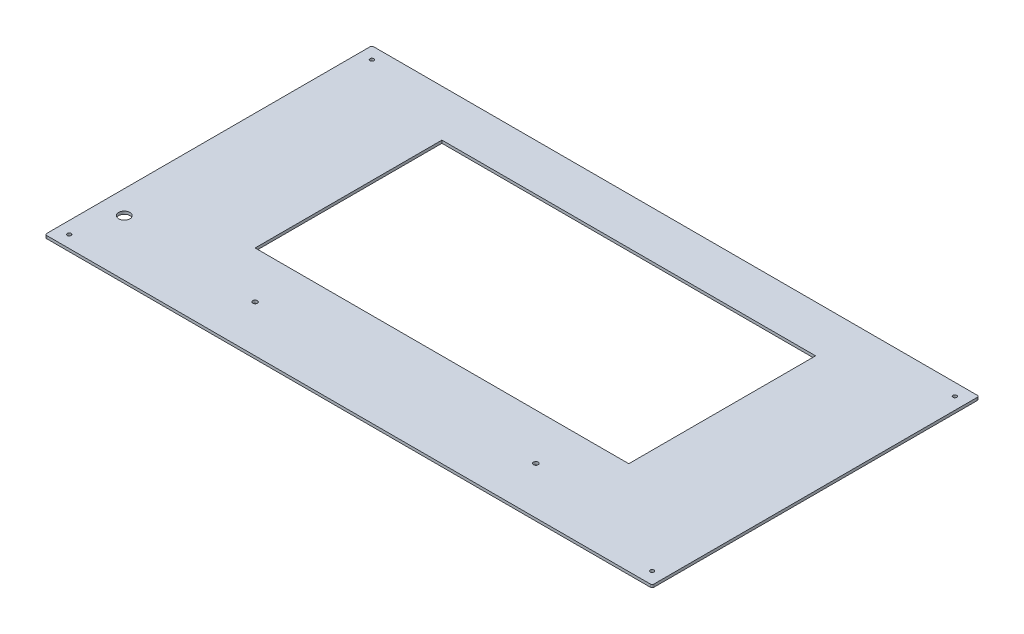
ISO-10303-21;
HEADER;
FILE_DESCRIPTION(('STEP AP214'),'2;1');
FILE_NAME('part.step','',(''),(''),'','','');
FILE_SCHEMA(('AUTOMOTIVE_DESIGN { 1 0 10303 214 1 1 1 1 }'));
ENDSEC;
DATA;
#1=APPLICATION_CONTEXT('core data for automotive mechanical design processes');
#2=APPLICATION_PROTOCOL_DEFINITION('international standard','automotive_design',2000,#1);
#3=PRODUCT_CONTEXT('',#1,'mechanical');
#4=PRODUCT('Part','Part','',(#3));
#5=PRODUCT_RELATED_PRODUCT_CATEGORY('part','',(#4));
#6=PRODUCT_DEFINITION_FORMATION('','',#4);
#7=PRODUCT_DEFINITION_CONTEXT('part definition',#1,'design');
#8=PRODUCT_DEFINITION('design','',#6,#7);
#9=PRODUCT_DEFINITION_SHAPE('','',#8);
#10=(LENGTH_UNIT() NAMED_UNIT(*) SI_UNIT(.MILLI.,.METRE.));
#11=(NAMED_UNIT(*) PLANE_ANGLE_UNIT() SI_UNIT($,.RADIAN.));
#12=(NAMED_UNIT(*) SI_UNIT($,.STERADIAN.) SOLID_ANGLE_UNIT());
#13=UNCERTAINTY_MEASURE_WITH_UNIT(LENGTH_MEASURE(1.E-05),#10,'distance_accuracy_value','');
#14=(GEOMETRIC_REPRESENTATION_CONTEXT(3) GLOBAL_UNCERTAINTY_ASSIGNED_CONTEXT((#13)) GLOBAL_UNIT_ASSIGNED_CONTEXT((#10,
#11,#12)) REPRESENTATION_CONTEXT('',''));
#15=CARTESIAN_POINT('',(0.,0.,0.));
#16=DIRECTION('',(0.,0.,1.));
#17=DIRECTION('',(1.,0.,0.));
#18=AXIS2_PLACEMENT_3D('',#15,#16,#17);
#19=CARTESIAN_POINT('',(648.,-3.,-348.));
#20=DIRECTION('',(0.,1.,0.));
#21=DIRECTION('',(0.,0.,1.));
#22=AXIS2_PLACEMENT_3D('',#19,#20,#21);
#23=CYLINDRICAL_SURFACE('',#22,2.);
#24=CARTESIAN_POINT('',(648.,0.,-348.));
#25=DIRECTION('',(0.,1.,0.));
#26=DIRECTION('',(0.,0.,-1.));
#27=AXIS2_PLACEMENT_3D('',#24,#25,#26);
#28=CIRCLE('',#27,2.);
#29=CARTESIAN_POINT('',(650.,0.,-348.));
#30=VERTEX_POINT('',#29);
#31=CARTESIAN_POINT('',(648.,0.,-350.));
#32=VERTEX_POINT('',#31);
#33=EDGE_CURVE('E186',#30,#32,#28,.T.);
#34=ORIENTED_EDGE('',*,*,#33,.F.);
#35=DIRECTION('',(0.,1.,0.));
#36=VECTOR('',#35,1.);
#37=CARTESIAN_POINT('',(650.,-3.,-348.));
#38=LINE('',#37,#36);
#39=CARTESIAN_POINT('',(650.,-3.,-348.));
#40=VERTEX_POINT('',#39);
#41=EDGE_CURVE('E11',#40,#30,#38,.T.);
#42=ORIENTED_EDGE('',*,*,#41,.F.);
#43=CARTESIAN_POINT('',(648.,-3.,-348.));
#44=DIRECTION('',(0.,1.,0.));
#45=DIRECTION('',(0.,0.,-1.));
#46=AXIS2_PLACEMENT_3D('',#43,#44,#45);
#47=CIRCLE('',#46,2.);
#48=CARTESIAN_POINT('',(648.,-3.,-350.));
#49=VERTEX_POINT('',#48);
#50=EDGE_CURVE('E189',#40,#49,#47,.T.);
#51=ORIENTED_EDGE('',*,*,#50,.T.);
#52=DIRECTION('',(0.,1.,0.));
#53=VECTOR('',#52,1.);
#54=CARTESIAN_POINT('',(648.,-3.,-350.));
#55=LINE('',#54,#53);
#56=EDGE_CURVE('E38',#49,#32,#55,.T.);
#57=ORIENTED_EDGE('',*,*,#56,.T.);
#58=EDGE_LOOP('',(#34,#42,#51,#57));
#59=FACE_BOUND('',#58,.T.);
#60=ADVANCED_FACE('F35',(#59),#23,.T.);
#61=CARTESIAN_POINT('',(650.,-3.,-2.));
#62=DIRECTION('',(1.,0.,0.));
#63=DIRECTION('',(0.,0.,-1.));
#64=AXIS2_PLACEMENT_3D('',#61,#62,#63);
#65=PLANE('',#64);
#66=DIRECTION('',(0.,0.,-1.));
#67=VECTOR('',#66,1.);
#68=CARTESIAN_POINT('',(650.,0.,-2.));
#69=LINE('',#68,#67);
#70=CARTESIAN_POINT('',(650.,0.,-2.));
#71=VERTEX_POINT('',#70);
#72=EDGE_CURVE('E193',#71,#30,#69,.T.);
#73=ORIENTED_EDGE('',*,*,#72,.F.);
#74=DIRECTION('',(0.,1.,0.));
#75=VECTOR('',#74,1.);
#76=CARTESIAN_POINT('',(650.,-3.,-2.));
#77=LINE('',#76,#75);
#78=CARTESIAN_POINT('',(650.,-3.,-2.));
#79=VERTEX_POINT('',#78);
#80=EDGE_CURVE('E43',#79,#71,#77,.T.);
#81=ORIENTED_EDGE('',*,*,#80,.F.);
#82=DIRECTION('',(0.,0.,-1.));
#83=VECTOR('',#82,1.);
#84=CARTESIAN_POINT('',(650.,-3.,-2.));
#85=LINE('',#84,#83);
#86=EDGE_CURVE('E211',#79,#40,#85,.T.);
#87=ORIENTED_EDGE('',*,*,#86,.T.);
#88=ORIENTED_EDGE('',*,*,#41,.T.);
#89=EDGE_LOOP('',(#73,#81,#87,#88));
#90=FACE_BOUND('',#89,.T.);
#91=ADVANCED_FACE('F258',(#90),#65,.T.);
#92=CARTESIAN_POINT('',(648.,-3.,-2.));
#93=DIRECTION('',(0.,1.,0.));
#94=DIRECTION('',(0.,0.,1.));
#95=AXIS2_PLACEMENT_3D('',#92,#93,#94);
#96=CYLINDRICAL_SURFACE('',#95,2.);
#97=CARTESIAN_POINT('',(648.,0.,-2.));
#98=DIRECTION('',(0.,1.,0.));
#99=DIRECTION('',(0.,0.,1.));
#100=AXIS2_PLACEMENT_3D('',#97,#98,#99);
#101=CIRCLE('',#100,2.);
#102=CARTESIAN_POINT('',(648.,0.,0.));
#103=VERTEX_POINT('',#102);
#104=EDGE_CURVE('E231',#103,#71,#101,.T.);
#105=ORIENTED_EDGE('',*,*,#104,.F.);
#106=DIRECTION('',(0.,1.,0.));
#107=VECTOR('',#106,1.);
#108=CARTESIAN_POINT('',(648.,-3.,0.));
#109=LINE('',#108,#107);
#110=CARTESIAN_POINT('',(648.,-3.,0.));
#111=VERTEX_POINT('',#110);
#112=EDGE_CURVE('E237',#111,#103,#109,.T.);
#113=ORIENTED_EDGE('',*,*,#112,.F.);
#114=CARTESIAN_POINT('',(648.,-3.,-2.));
#115=DIRECTION('',(0.,1.,0.));
#116=DIRECTION('',(0.,0.,1.));
#117=AXIS2_PLACEMENT_3D('',#114,#115,#116);
#118=CIRCLE('',#117,2.);
#119=EDGE_CURVE('E208',#111,#79,#118,.T.);
#120=ORIENTED_EDGE('',*,*,#119,.T.);
#121=ORIENTED_EDGE('',*,*,#80,.T.);
#122=EDGE_LOOP('',(#105,#113,#120,#121));
#123=FACE_BOUND('',#122,.T.);
#124=ADVANCED_FACE('F278',(#123),#96,.T.);
#125=CARTESIAN_POINT('',(2.00000000000001,-3.,0.));
#126=DIRECTION('',(0.,0.,1.));
#127=DIRECTION('',(1.,0.,0.));
#128=AXIS2_PLACEMENT_3D('',#125,#126,#127);
#129=PLANE('',#128);
#130=DIRECTION('',(1.,0.,0.));
#131=VECTOR('',#130,1.);
#132=CARTESIAN_POINT('',(2.00000000000001,0.,0.));
#133=LINE('',#132,#131);
#134=CARTESIAN_POINT('',(2.00000000000001,0.,0.));
#135=VERTEX_POINT('',#134);
#136=EDGE_CURVE('E228',#135,#103,#133,.T.);
#137=ORIENTED_EDGE('',*,*,#136,.F.);
#138=DIRECTION('',(0.,1.,0.));
#139=VECTOR('',#138,1.);
#140=CARTESIAN_POINT('',(2.00000000000001,-3.,0.));
#141=LINE('',#140,#139);
#142=CARTESIAN_POINT('',(2.00000000000001,-3.,0.));
#143=VERTEX_POINT('',#142);
#144=EDGE_CURVE('E239',#143,#135,#141,.T.);
#145=ORIENTED_EDGE('',*,*,#144,.F.);
#146=DIRECTION('',(1.,0.,0.));
#147=VECTOR('',#146,1.);
#148=CARTESIAN_POINT('',(2.00000000000001,-3.,0.));
#149=LINE('',#148,#147);
#150=EDGE_CURVE('E205',#143,#111,#149,.T.);
#151=ORIENTED_EDGE('',*,*,#150,.T.);
#152=ORIENTED_EDGE('',*,*,#112,.T.);
#153=EDGE_LOOP('',(#137,#145,#151,#152));
#154=FACE_BOUND('',#153,.T.);
#155=ADVANCED_FACE('F276',(#154),#129,.T.);
#156=CARTESIAN_POINT('',(2.,-3.,-2.));
#157=DIRECTION('',(0.,1.,0.));
#158=DIRECTION('',(0.,0.,1.));
#159=AXIS2_PLACEMENT_3D('',#156,#157,#158);
#160=CYLINDRICAL_SURFACE('',#159,2.);
#161=CARTESIAN_POINT('',(2.,0.,-2.));
#162=DIRECTION('',(0.,1.,0.));
#163=DIRECTION('',(0.,0.,-1.));
#164=AXIS2_PLACEMENT_3D('',#161,#162,#163);
#165=CIRCLE('',#164,2.);
#166=CARTESIAN_POINT('',(0.,0.,-2.00000000000001));
#167=VERTEX_POINT('',#166);
#168=EDGE_CURVE('E225',#167,#135,#165,.T.);
#169=ORIENTED_EDGE('',*,*,#168,.F.);
#170=DIRECTION('',(0.,1.,0.));
#171=VECTOR('',#170,1.);
#172=CARTESIAN_POINT('',(0.,-3.,-2.00000000000001));
#173=LINE('',#172,#171);
#174=CARTESIAN_POINT('',(0.,-3.,-2.00000000000001));
#175=VERTEX_POINT('',#174);
#176=EDGE_CURVE('E241',#175,#167,#173,.T.);
#177=ORIENTED_EDGE('',*,*,#176,.F.);
#178=CARTESIAN_POINT('',(2.,-3.,-2.));
#179=DIRECTION('',(0.,1.,0.));
#180=DIRECTION('',(0.,0.,-1.));
#181=AXIS2_PLACEMENT_3D('',#178,#179,#180);
#182=CIRCLE('',#181,2.);
#183=EDGE_CURVE('E202',#175,#143,#182,.T.);
#184=ORIENTED_EDGE('',*,*,#183,.T.);
#185=ORIENTED_EDGE('',*,*,#144,.T.);
#186=EDGE_LOOP('',(#169,#177,#184,#185));
#187=FACE_BOUND('',#186,.T.);
#188=ADVANCED_FACE('F272',(#187),#160,.T.);
#189=CARTESIAN_POINT('',(0.,-3.,-2.00000000000001));
#190=DIRECTION('',(-1.,0.,0.));
#191=DIRECTION('',(0.,0.,1.));
#192=AXIS2_PLACEMENT_3D('',#189,#190,#191);
#193=PLANE('',#192);
#194=DIRECTION('',(0.,0.,1.));
#195=VECTOR('',#194,1.);
#196=CARTESIAN_POINT('',(0.,0.,-2.00000000000001));
#197=LINE('',#196,#195);
#198=CARTESIAN_POINT('',(0.,0.,-348.));
#199=VERTEX_POINT('',#198);
#200=EDGE_CURVE('E222',#199,#167,#197,.T.);
#201=ORIENTED_EDGE('',*,*,#200,.F.);
#202=DIRECTION('',(0.,1.,0.));
#203=VECTOR('',#202,1.);
#204=CARTESIAN_POINT('',(0.,-3.,-348.));
#205=LINE('',#204,#203);
#206=CARTESIAN_POINT('',(0.,-3.,-348.));
#207=VERTEX_POINT('',#206);
#208=EDGE_CURVE('E243',#207,#199,#205,.T.);
#209=ORIENTED_EDGE('',*,*,#208,.F.);
#210=DIRECTION('',(0.,0.,1.));
#211=VECTOR('',#210,1.);
#212=CARTESIAN_POINT('',(0.,-3.,-2.00000000000001));
#213=LINE('',#212,#211);
#214=EDGE_CURVE('E199',#207,#175,#213,.T.);
#215=ORIENTED_EDGE('',*,*,#214,.T.);
#216=ORIENTED_EDGE('',*,*,#176,.T.);
#217=EDGE_LOOP('',(#201,#209,#215,#216));
#218=FACE_BOUND('',#217,.T.);
#219=ADVANCED_FACE('F270',(#218),#193,.T.);
#220=CARTESIAN_POINT('',(2.,-3.,-348.));
#221=DIRECTION('',(0.,1.,0.));
#222=DIRECTION('',(0.,0.,1.));
#223=AXIS2_PLACEMENT_3D('',#220,#221,#222);
#224=CYLINDRICAL_SURFACE('',#223,2.);
#225=CARTESIAN_POINT('',(2.,0.,-348.));
#226=DIRECTION('',(0.,1.,0.));
#227=DIRECTION('',(0.,0.,1.));
#228=AXIS2_PLACEMENT_3D('',#225,#226,#227);
#229=CIRCLE('',#228,2.);
#230=CARTESIAN_POINT('',(2.,0.,-350.));
#231=VERTEX_POINT('',#230);
#232=EDGE_CURVE('E219',#231,#199,#229,.T.);
#233=ORIENTED_EDGE('',*,*,#232,.F.);
#234=DIRECTION('',(0.,1.,0.));
#235=VECTOR('',#234,1.);
#236=CARTESIAN_POINT('',(2.,-3.,-350.));
#237=LINE('',#236,#235);
#238=CARTESIAN_POINT('',(2.,-3.,-350.));
#239=VERTEX_POINT('',#238);
#240=EDGE_CURVE('E244',#239,#231,#237,.T.);
#241=ORIENTED_EDGE('',*,*,#240,.F.);
#242=CARTESIAN_POINT('',(2.,-3.,-348.));
#243=DIRECTION('',(0.,1.,0.));
#244=DIRECTION('',(0.,0.,1.));
#245=AXIS2_PLACEMENT_3D('',#242,#243,#244);
#246=CIRCLE('',#245,2.);
#247=EDGE_CURVE('E196',#239,#207,#246,.T.);
#248=ORIENTED_EDGE('',*,*,#247,.T.);
#249=ORIENTED_EDGE('',*,*,#208,.T.);
#250=EDGE_LOOP('',(#233,#241,#248,#249));
#251=FACE_BOUND('',#250,.T.);
#252=ADVANCED_FACE('F266',(#251),#224,.T.);
#253=CARTESIAN_POINT('',(2.,-3.,-350.));
#254=DIRECTION('',(0.,0.,-1.));
#255=DIRECTION('',(-1.,0.,0.));
#256=AXIS2_PLACEMENT_3D('',#253,#254,#255);
#257=PLANE('',#256);
#258=DIRECTION('',(-1.,0.,0.));
#259=VECTOR('',#258,1.);
#260=CARTESIAN_POINT('',(2.,0.,-350.));
#261=LINE('',#260,#259);
#262=EDGE_CURVE('E216',#32,#231,#261,.T.);
#263=ORIENTED_EDGE('',*,*,#262,.F.);
#264=ORIENTED_EDGE('',*,*,#56,.F.);
#265=DIRECTION('',(-1.,0.,0.));
#266=VECTOR('',#265,1.);
#267=CARTESIAN_POINT('',(2.,-3.,-350.));
#268=LINE('',#267,#266);
#269=EDGE_CURVE('E192',#49,#239,#268,.T.);
#270=ORIENTED_EDGE('',*,*,#269,.T.);
#271=ORIENTED_EDGE('',*,*,#240,.T.);
#272=EDGE_LOOP('',(#263,#264,#270,#271));
#273=FACE_BOUND('',#272,.T.);
#274=ADVANCED_FACE('F252',(#273),#257,.T.);
#275=CARTESIAN_POINT('',(648.,-3.,-348.));
#276=DIRECTION('',(0.,-1.,0.));
#277=DIRECTION('',(0.,0.,-1.));
#278=AXIS2_PLACEMENT_3D('',#275,#276,#277);
#279=PLANE('',#278);
#280=CARTESIAN_POINT('',(25.,-3.,-60.));
#281=DIRECTION('',(0.,1.,0.));
#282=DIRECTION('',(0.,0.,1.));
#283=AXIS2_PLACEMENT_3D('',#280,#281,#282);
#284=CIRCLE('',#283,6.00000000000001);
#285=CARTESIAN_POINT('',(25.,-3.,-54.));
#286=VERTEX_POINT('',#285);
#287=EDGE_CURVE('E465',#286,#286,#284,.T.);
#288=ORIENTED_EDGE('',*,*,#287,.T.);
#289=EDGE_LOOP('',(#288));
#290=FACE_BOUND('',#289,.T.);
#291=CARTESIAN_POINT('',(175.,-3.,-50.));
#292=DIRECTION('',(0.,1.,0.));
#293=DIRECTION('',(0.,0.,1.));
#294=AXIS2_PLACEMENT_3D('',#291,#292,#293);
#295=CIRCLE('',#294,2.50000000000002);
#296=CARTESIAN_POINT('',(175.,-3.,-47.5));
#297=VERTEX_POINT('',#296);
#298=EDGE_CURVE('E473',#297,#297,#295,.T.);
#299=ORIENTED_EDGE('',*,*,#298,.T.);
#300=EDGE_LOOP('',(#299));
#301=FACE_BOUND('',#300,.T.);
#302=CARTESIAN_POINT('',(475.,-3.,-50.4925614395433));
#303=DIRECTION('',(0.,1.,0.));
#304=DIRECTION('',(0.,0.,1.));
#305=AXIS2_PLACEMENT_3D('',#302,#303,#304);
#306=CIRCLE('',#305,2.50000000000002);
#307=CARTESIAN_POINT('',(475.,-3.,-47.9925614395433));
#308=VERTEX_POINT('',#307);
#309=EDGE_CURVE('E155',#308,#308,#306,.T.);
#310=ORIENTED_EDGE('',*,*,#309,.T.);
#311=EDGE_LOOP('',(#310));
#312=FACE_BOUND('',#311,.T.);
#313=DIRECTION('',(0.,0.,-1.));
#314=VECTOR('',#313,1.);
#315=CARTESIAN_POINT('',(525.,-3.,-100.));
#316=LINE('',#315,#314);
#317=CARTESIAN_POINT('',(525.,-3.,-100.));
#318=VERTEX_POINT('',#317);
#319=CARTESIAN_POINT('',(525.,-3.,-300.));
#320=VERTEX_POINT('',#319);
#321=EDGE_CURVE('E126',#318,#320,#316,.T.);
#322=ORIENTED_EDGE('',*,*,#321,.T.);
#323=DIRECTION('',(-1.,0.,0.));
#324=VECTOR('',#323,1.);
#325=CARTESIAN_POINT('',(525.,-3.,-300.));
#326=LINE('',#325,#324);
#327=CARTESIAN_POINT('',(125.,-3.,-300.));
#328=VERTEX_POINT('',#327);
#329=EDGE_CURVE('E135',#320,#328,#326,.T.);
#330=ORIENTED_EDGE('',*,*,#329,.T.);
#331=DIRECTION('',(0.,0.,1.));
#332=VECTOR('',#331,1.);
#333=CARTESIAN_POINT('',(125.,-3.,-99.9999999999999));
#334=LINE('',#333,#332);
#335=CARTESIAN_POINT('',(125.,-3.,-99.9999999999999));
#336=VERTEX_POINT('',#335);
#337=EDGE_CURVE('E51',#328,#336,#334,.T.);
#338=ORIENTED_EDGE('',*,*,#337,.T.);
#339=DIRECTION('',(1.,0.,0.));
#340=VECTOR('',#339,1.);
#341=CARTESIAN_POINT('',(525.,-3.,-100.));
#342=LINE('',#341,#340);
#343=EDGE_CURVE('E132',#336,#318,#342,.T.);
#344=ORIENTED_EDGE('',*,*,#343,.T.);
#345=EDGE_LOOP('',(#322,#330,#338,#344));
#346=FACE_BOUND('',#345,.T.);
#347=CARTESIAN_POINT('',(637.,-3.,-337.));
#348=DIRECTION('',(0.,1.,0.));
#349=DIRECTION('',(0.,0.,1.));
#350=AXIS2_PLACEMENT_3D('',#347,#348,#349);
#351=CIRCLE('',#350,2.);
#352=CARTESIAN_POINT('',(637.,-3.,-335.));
#353=VERTEX_POINT('',#352);
#354=EDGE_CURVE('E165',#353,#353,#351,.T.);
#355=ORIENTED_EDGE('',*,*,#354,.T.);
#356=EDGE_LOOP('',(#355));
#357=FACE_BOUND('',#356,.T.);
#358=CARTESIAN_POINT('',(13.,-3.,-337.));
#359=DIRECTION('',(0.,1.,0.));
#360=DIRECTION('',(0.,0.,1.));
#361=AXIS2_PLACEMENT_3D('',#358,#359,#360);
#362=CIRCLE('',#361,2.);
#363=CARTESIAN_POINT('',(13.,-3.,-335.));
#364=VERTEX_POINT('',#363);
#365=EDGE_CURVE('E171',#364,#364,#362,.T.);
#366=ORIENTED_EDGE('',*,*,#365,.T.);
#367=EDGE_LOOP('',(#366));
#368=FACE_BOUND('',#367,.T.);
#369=CARTESIAN_POINT('',(637.,-3.,-13.));
#370=DIRECTION('',(0.,1.,0.));
#371=DIRECTION('',(0.,0.,1.));
#372=AXIS2_PLACEMENT_3D('',#369,#370,#371);
#373=CIRCLE('',#372,2.);
#374=CARTESIAN_POINT('',(637.,-3.,-11.));
#375=VERTEX_POINT('',#374);
#376=EDGE_CURVE('E177',#375,#375,#373,.T.);
#377=ORIENTED_EDGE('',*,*,#376,.T.);
#378=EDGE_LOOP('',(#377));
#379=FACE_BOUND('',#378,.T.);
#380=CARTESIAN_POINT('',(13.,-3.,-13.));
#381=DIRECTION('',(0.,1.,0.));
#382=DIRECTION('',(0.,0.,1.));
#383=AXIS2_PLACEMENT_3D('',#380,#381,#382);
#384=CIRCLE('',#383,2.);
#385=CARTESIAN_POINT('',(13.,-3.,-11.));
#386=VERTEX_POINT('',#385);
#387=EDGE_CURVE('E183',#386,#386,#384,.T.);
#388=ORIENTED_EDGE('',*,*,#387,.T.);
#389=EDGE_LOOP('',(#388));
#390=FACE_BOUND('',#389,.T.);
#391=ORIENTED_EDGE('',*,*,#50,.F.);
#392=ORIENTED_EDGE('',*,*,#86,.F.);
#393=ORIENTED_EDGE('',*,*,#119,.F.);
#394=ORIENTED_EDGE('',*,*,#150,.F.);
#395=ORIENTED_EDGE('',*,*,#183,.F.);
#396=ORIENTED_EDGE('',*,*,#214,.F.);
#397=ORIENTED_EDGE('',*,*,#247,.F.);
#398=ORIENTED_EDGE('',*,*,#269,.F.);
#399=EDGE_LOOP('',(#391,#392,#393,#394,#395,#396,#397,#398));
#400=FACE_BOUND('',#399,.T.);
#401=ADVANCED_FACE('F139',(#290,#301,#312,#346,#357,#368,#379,#390,#400),#279,.T.);
#402=CARTESIAN_POINT('',(648.,0.,-348.));
#403=DIRECTION('',(0.,-1.,0.));
#404=DIRECTION('',(0.,0.,-1.));
#405=AXIS2_PLACEMENT_3D('',#402,#403,#404);
#406=PLANE('',#405);
#407=CARTESIAN_POINT('',(25.,0.,-60.));
#408=DIRECTION('',(0.,1.,0.));
#409=DIRECTION('',(0.,0.,1.));
#410=AXIS2_PLACEMENT_3D('',#407,#408,#409);
#411=CIRCLE('',#410,6.00000000000001);
#412=CARTESIAN_POINT('',(25.,0.,-54.));
#413=VERTEX_POINT('',#412);
#414=EDGE_CURVE('E468',#413,#413,#411,.T.);
#415=ORIENTED_EDGE('',*,*,#414,.F.);
#416=EDGE_LOOP('',(#415));
#417=FACE_BOUND('',#416,.T.);
#418=CARTESIAN_POINT('',(175.,0.,-50.));
#419=DIRECTION('',(0.,1.,0.));
#420=DIRECTION('',(0.,0.,1.));
#421=AXIS2_PLACEMENT_3D('',#418,#419,#420);
#422=CIRCLE('',#421,2.50000000000002);
#423=CARTESIAN_POINT('',(175.,0.,-47.5));
#424=VERTEX_POINT('',#423);
#425=EDGE_CURVE('E470',#424,#424,#422,.T.);
#426=ORIENTED_EDGE('',*,*,#425,.F.);
#427=EDGE_LOOP('',(#426));
#428=FACE_BOUND('',#427,.T.);
#429=CARTESIAN_POINT('',(475.,0.,-50.4925614395433));
#430=DIRECTION('',(0.,1.,0.));
#431=DIRECTION('',(0.,0.,1.));
#432=AXIS2_PLACEMENT_3D('',#429,#430,#431);
#433=CIRCLE('',#432,2.50000000000002);
#434=CARTESIAN_POINT('',(475.,0.,-47.9925614395433));
#435=VERTEX_POINT('',#434);
#436=EDGE_CURVE('E148',#435,#435,#433,.T.);
#437=ORIENTED_EDGE('',*,*,#436,.F.);
#438=EDGE_LOOP('',(#437));
#439=FACE_BOUND('',#438,.T.);
#440=DIRECTION('',(-1.,0.,0.));
#441=VECTOR('',#440,1.);
#442=CARTESIAN_POINT('',(525.,0.,-300.));
#443=LINE('',#442,#441);
#444=CARTESIAN_POINT('',(525.,0.,-300.));
#445=VERTEX_POINT('',#444);
#446=CARTESIAN_POINT('',(125.,0.,-300.));
#447=VERTEX_POINT('',#446);
#448=EDGE_CURVE('E154',#445,#447,#443,.T.);
#449=ORIENTED_EDGE('',*,*,#448,.F.);
#450=DIRECTION('',(0.,0.,-1.));
#451=VECTOR('',#450,1.);
#452=CARTESIAN_POINT('',(525.,0.,-100.));
#453=LINE('',#452,#451);
#454=CARTESIAN_POINT('',(525.,0.,-100.));
#455=VERTEX_POINT('',#454);
#456=EDGE_CURVE('E59',#455,#445,#453,.T.);
#457=ORIENTED_EDGE('',*,*,#456,.F.);
#458=DIRECTION('',(1.,0.,0.));
#459=VECTOR('',#458,1.);
#460=CARTESIAN_POINT('',(525.,0.,-100.));
#461=LINE('',#460,#459);
#462=CARTESIAN_POINT('',(125.,0.,-99.9999999999999));
#463=VERTEX_POINT('',#462);
#464=EDGE_CURVE('E142',#463,#455,#461,.T.);
#465=ORIENTED_EDGE('',*,*,#464,.F.);
#466=DIRECTION('',(0.,0.,1.));
#467=VECTOR('',#466,1.);
#468=CARTESIAN_POINT('',(125.,0.,-99.9999999999999));
#469=LINE('',#468,#467);
#470=EDGE_CURVE('E145',#447,#463,#469,.T.);
#471=ORIENTED_EDGE('',*,*,#470,.F.);
#472=EDGE_LOOP('',(#449,#457,#465,#471));
#473=FACE_BOUND('',#472,.T.);
#474=CARTESIAN_POINT('',(637.,0.,-337.));
#475=DIRECTION('',(0.,1.,0.));
#476=DIRECTION('',(0.,0.,1.));
#477=AXIS2_PLACEMENT_3D('',#474,#475,#476);
#478=CIRCLE('',#477,2.);
#479=CARTESIAN_POINT('',(637.,0.,-335.));
#480=VERTEX_POINT('',#479);
#481=EDGE_CURVE('E161',#480,#480,#478,.T.);
#482=ORIENTED_EDGE('',*,*,#481,.F.);
#483=EDGE_LOOP('',(#482));
#484=FACE_BOUND('',#483,.T.);
#485=CARTESIAN_POINT('',(13.,0.,-337.));
#486=DIRECTION('',(0.,1.,0.));
#487=DIRECTION('',(0.,0.,1.));
#488=AXIS2_PLACEMENT_3D('',#485,#486,#487);
#489=CIRCLE('',#488,2.);
#490=CARTESIAN_POINT('',(13.,0.,-335.));
#491=VERTEX_POINT('',#490);
#492=EDGE_CURVE('E168',#491,#491,#489,.T.);
#493=ORIENTED_EDGE('',*,*,#492,.F.);
#494=EDGE_LOOP('',(#493));
#495=FACE_BOUND('',#494,.T.);
#496=CARTESIAN_POINT('',(637.,0.,-13.));
#497=DIRECTION('',(0.,1.,0.));
#498=DIRECTION('',(0.,0.,1.));
#499=AXIS2_PLACEMENT_3D('',#496,#497,#498);
#500=CIRCLE('',#499,2.);
#501=CARTESIAN_POINT('',(637.,0.,-11.));
#502=VERTEX_POINT('',#501);
#503=EDGE_CURVE('E174',#502,#502,#500,.T.);
#504=ORIENTED_EDGE('',*,*,#503,.F.);
#505=EDGE_LOOP('',(#504));
#506=FACE_BOUND('',#505,.T.);
#507=CARTESIAN_POINT('',(13.,0.,-13.));
#508=DIRECTION('',(0.,1.,0.));
#509=DIRECTION('',(0.,0.,1.));
#510=AXIS2_PLACEMENT_3D('',#507,#508,#509);
#511=CIRCLE('',#510,2.);
#512=CARTESIAN_POINT('',(13.,0.,-11.));
#513=VERTEX_POINT('',#512);
#514=EDGE_CURVE('E180',#513,#513,#511,.T.);
#515=ORIENTED_EDGE('',*,*,#514,.F.);
#516=EDGE_LOOP('',(#515));
#517=FACE_BOUND('',#516,.T.);
#518=ORIENTED_EDGE('',*,*,#33,.T.);
#519=ORIENTED_EDGE('',*,*,#262,.T.);
#520=ORIENTED_EDGE('',*,*,#232,.T.);
#521=ORIENTED_EDGE('',*,*,#200,.T.);
#522=ORIENTED_EDGE('',*,*,#168,.T.);
#523=ORIENTED_EDGE('',*,*,#136,.T.);
#524=ORIENTED_EDGE('',*,*,#104,.T.);
#525=ORIENTED_EDGE('',*,*,#72,.T.);
#526=EDGE_LOOP('',(#518,#519,#520,#521,#522,#523,#524,#525));
#527=FACE_BOUND('',#526,.T.);
#528=ADVANCED_FACE('F254',(#417,#428,#439,#473,#484,#495,#506,#517,#527),#406,.F.);
#529=CARTESIAN_POINT('',(13.,-3.,-13.));
#530=DIRECTION('',(0.,1.,0.));
#531=DIRECTION('',(0.,0.,1.));
#532=AXIS2_PLACEMENT_3D('',#529,#530,#531);
#533=CYLINDRICAL_SURFACE('',#532,2.);
#534=ORIENTED_EDGE('',*,*,#387,.F.);
#535=EDGE_LOOP('',(#534));
#536=FACE_BOUND('',#535,.T.);
#537=ORIENTED_EDGE('',*,*,#514,.T.);
#538=EDGE_LOOP('',(#537));
#539=FACE_BOUND('',#538,.T.);
#540=ADVANCED_FACE('F353',(#536,#539),#533,.F.);
#541=CARTESIAN_POINT('',(637.,-3.,-13.));
#542=DIRECTION('',(0.,1.,0.));
#543=DIRECTION('',(0.,0.,1.));
#544=AXIS2_PLACEMENT_3D('',#541,#542,#543);
#545=CYLINDRICAL_SURFACE('',#544,2.);
#546=ORIENTED_EDGE('',*,*,#376,.F.);
#547=EDGE_LOOP('',(#546));
#548=FACE_BOUND('',#547,.T.);
#549=ORIENTED_EDGE('',*,*,#503,.T.);
#550=EDGE_LOOP('',(#549));
#551=FACE_BOUND('',#550,.T.);
#552=ADVANCED_FACE('F363',(#548,#551),#545,.F.);
#553=CARTESIAN_POINT('',(13.,-3.,-337.));
#554=DIRECTION('',(0.,1.,0.));
#555=DIRECTION('',(0.,0.,1.));
#556=AXIS2_PLACEMENT_3D('',#553,#554,#555);
#557=CYLINDRICAL_SURFACE('',#556,2.);
#558=ORIENTED_EDGE('',*,*,#365,.F.);
#559=EDGE_LOOP('',(#558));
#560=FACE_BOUND('',#559,.T.);
#561=ORIENTED_EDGE('',*,*,#492,.T.);
#562=EDGE_LOOP('',(#561));
#563=FACE_BOUND('',#562,.T.);
#564=ADVANCED_FACE('F373',(#560,#563),#557,.F.);
#565=CARTESIAN_POINT('',(637.,-3.,-337.));
#566=DIRECTION('',(0.,1.,0.));
#567=DIRECTION('',(0.,0.,1.));
#568=AXIS2_PLACEMENT_3D('',#565,#566,#567);
#569=CYLINDRICAL_SURFACE('',#568,2.);
#570=ORIENTED_EDGE('',*,*,#354,.F.);
#571=EDGE_LOOP('',(#570));
#572=FACE_BOUND('',#571,.T.);
#573=ORIENTED_EDGE('',*,*,#481,.T.);
#574=EDGE_LOOP('',(#573));
#575=FACE_BOUND('',#574,.T.);
#576=ADVANCED_FACE('F383',(#572,#575),#569,.F.);
#577=CARTESIAN_POINT('',(525.,-3.,-100.));
#578=DIRECTION('',(1.,0.,0.));
#579=DIRECTION('',(0.,0.,-1.));
#580=AXIS2_PLACEMENT_3D('',#577,#578,#579);
#581=PLANE('',#580);
#582=ORIENTED_EDGE('',*,*,#456,.T.);
#583=DIRECTION('',(0.,1.,0.));
#584=VECTOR('',#583,1.);
#585=CARTESIAN_POINT('',(525.,-3.,-300.));
#586=LINE('',#585,#584);
#587=EDGE_CURVE('E122',#320,#445,#586,.T.);
#588=ORIENTED_EDGE('',*,*,#587,.F.);
#589=ORIENTED_EDGE('',*,*,#321,.F.);
#590=DIRECTION('',(0.,1.,0.));
#591=VECTOR('',#590,1.);
#592=CARTESIAN_POINT('',(525.,-3.,-100.));
#593=LINE('',#592,#591);
#594=EDGE_CURVE('E159',#318,#455,#593,.T.);
#595=ORIENTED_EDGE('',*,*,#594,.T.);
#596=EDGE_LOOP('',(#582,#588,#589,#595));
#597=FACE_BOUND('',#596,.T.);
#598=ADVANCED_FACE('F124',(#597),#581,.F.);
#599=CARTESIAN_POINT('',(525.,-3.,-100.));
#600=DIRECTION('',(0.,0.,1.));
#601=DIRECTION('',(1.,0.,0.));
#602=AXIS2_PLACEMENT_3D('',#599,#600,#601);
#603=PLANE('',#602);
#604=ORIENTED_EDGE('',*,*,#464,.T.);
#605=ORIENTED_EDGE('',*,*,#594,.F.);
#606=ORIENTED_EDGE('',*,*,#343,.F.);
#607=DIRECTION('',(0.,1.,0.));
#608=VECTOR('',#607,1.);
#609=CARTESIAN_POINT('',(125.,-3.,-99.9999999999999));
#610=LINE('',#609,#608);
#611=EDGE_CURVE('E162',#336,#463,#610,.T.);
#612=ORIENTED_EDGE('',*,*,#611,.T.);
#613=EDGE_LOOP('',(#604,#605,#606,#612));
#614=FACE_BOUND('',#613,.T.);
#615=ADVANCED_FACE('F402',(#614),#603,.F.);
#616=CARTESIAN_POINT('',(125.,-3.,-99.9999999999999));
#617=DIRECTION('',(-1.,0.,0.));
#618=DIRECTION('',(0.,0.,1.));
#619=AXIS2_PLACEMENT_3D('',#616,#617,#618);
#620=PLANE('',#619);
#621=ORIENTED_EDGE('',*,*,#470,.T.);
#622=ORIENTED_EDGE('',*,*,#611,.F.);
#623=ORIENTED_EDGE('',*,*,#337,.F.);
#624=DIRECTION('',(0.,1.,0.));
#625=VECTOR('',#624,1.);
#626=CARTESIAN_POINT('',(125.,-3.,-300.));
#627=LINE('',#626,#625);
#628=EDGE_CURVE('E131',#328,#447,#627,.T.);
#629=ORIENTED_EDGE('',*,*,#628,.T.);
#630=EDGE_LOOP('',(#621,#622,#623,#629));
#631=FACE_BOUND('',#630,.T.);
#632=ADVANCED_FACE('F411',(#631),#620,.F.);
#633=CARTESIAN_POINT('',(525.,-3.,-300.));
#634=DIRECTION('',(0.,0.,-1.));
#635=DIRECTION('',(-1.,0.,0.));
#636=AXIS2_PLACEMENT_3D('',#633,#634,#635);
#637=PLANE('',#636);
#638=ORIENTED_EDGE('',*,*,#448,.T.);
#639=ORIENTED_EDGE('',*,*,#628,.F.);
#640=ORIENTED_EDGE('',*,*,#329,.F.);
#641=ORIENTED_EDGE('',*,*,#587,.T.);
#642=EDGE_LOOP('',(#638,#639,#640,#641));
#643=FACE_BOUND('',#642,.T.);
#644=ADVANCED_FACE('F136',(#643),#637,.F.);
#645=CARTESIAN_POINT('',(475.,-3.,-50.4925614395433));
#646=DIRECTION('',(0.,1.,0.));
#647=DIRECTION('',(0.,0.,1.));
#648=AXIS2_PLACEMENT_3D('',#645,#646,#647);
#649=CYLINDRICAL_SURFACE('',#648,2.50000000000002);
#650=ORIENTED_EDGE('',*,*,#309,.F.);
#651=EDGE_LOOP('',(#650));
#652=FACE_BOUND('',#651,.T.);
#653=ORIENTED_EDGE('',*,*,#436,.T.);
#654=EDGE_LOOP('',(#653));
#655=FACE_BOUND('',#654,.T.);
#656=ADVANCED_FACE('F429',(#652,#655),#649,.F.);
#657=CARTESIAN_POINT('',(175.,-3.,-50.));
#658=DIRECTION('',(0.,1.,0.));
#659=DIRECTION('',(0.,0.,1.));
#660=AXIS2_PLACEMENT_3D('',#657,#658,#659);
#661=CYLINDRICAL_SURFACE('',#660,2.50000000000002);
#662=ORIENTED_EDGE('',*,*,#298,.F.);
#663=EDGE_LOOP('',(#662));
#664=FACE_BOUND('',#663,.T.);
#665=ORIENTED_EDGE('',*,*,#425,.T.);
#666=EDGE_LOOP('',(#665));
#667=FACE_BOUND('',#666,.T.);
#668=ADVANCED_FACE('F438',(#664,#667),#661,.F.);
#669=CARTESIAN_POINT('',(25.,-3.,-60.));
#670=DIRECTION('',(0.,1.,0.));
#671=DIRECTION('',(0.,0.,1.));
#672=AXIS2_PLACEMENT_3D('',#669,#670,#671);
#673=CYLINDRICAL_SURFACE('',#672,6.00000000000001);
#674=ORIENTED_EDGE('',*,*,#287,.F.);
#675=EDGE_LOOP('',(#674));
#676=FACE_BOUND('',#675,.T.);
#677=ORIENTED_EDGE('',*,*,#414,.T.);
#678=EDGE_LOOP('',(#677));
#679=FACE_BOUND('',#678,.T.);
#680=ADVANCED_FACE('F448',(#676,#679),#673,.F.);
#681=CLOSED_SHELL('',(#60,#91,#124,#155,#188,#219,#252,#274,#401,#528,#540,#552,#564,#576,#598,
#615,#632,#644,#656,#668,#680));
#682=MANIFOLD_SOLID_BREP('B2',#681);
#683=ADVANCED_BREP_SHAPE_REPRESENTATION('',(#18,#682),#14);
#684=SHAPE_DEFINITION_REPRESENTATION(#9,#683);
ENDSEC;
END-ISO-10303-21;
